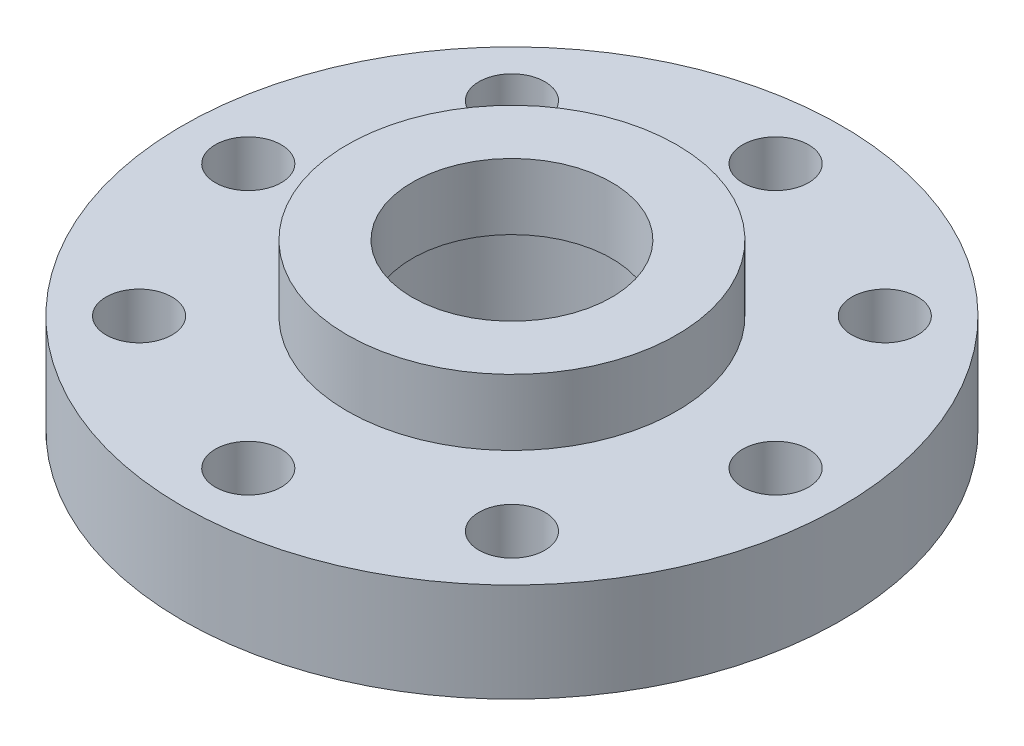
ISO-10303-21;
HEADER;
FILE_DESCRIPTION(('STEP AP214'),'2;1');
FILE_NAME('part.step','',(''),(''),'','','');
FILE_SCHEMA(('AUTOMOTIVE_DESIGN { 1 0 10303 214 1 1 1 1 }'));
ENDSEC;
DATA;
#1=APPLICATION_CONTEXT('core data for automotive mechanical design processes');
#2=APPLICATION_PROTOCOL_DEFINITION('international standard','automotive_design',2000,#1);
#3=PRODUCT_CONTEXT('',#1,'mechanical');
#4=PRODUCT('Part','Part','',(#3));
#5=PRODUCT_RELATED_PRODUCT_CATEGORY('part','',(#4));
#6=PRODUCT_DEFINITION_FORMATION('','',#4);
#7=PRODUCT_DEFINITION_CONTEXT('part definition',#1,'design');
#8=PRODUCT_DEFINITION('design','',#6,#7);
#9=PRODUCT_DEFINITION_SHAPE('','',#8);
#10=(LENGTH_UNIT() NAMED_UNIT(*) SI_UNIT(.MILLI.,.METRE.));
#11=(NAMED_UNIT(*) PLANE_ANGLE_UNIT() SI_UNIT($,.RADIAN.));
#12=(NAMED_UNIT(*) SI_UNIT($,.STERADIAN.) SOLID_ANGLE_UNIT());
#13=UNCERTAINTY_MEASURE_WITH_UNIT(LENGTH_MEASURE(1.E-05),#10,'distance_accuracy_value','');
#14=(GEOMETRIC_REPRESENTATION_CONTEXT(3) GLOBAL_UNCERTAINTY_ASSIGNED_CONTEXT((#13)) GLOBAL_UNIT_ASSIGNED_CONTEXT((#10,
#11,#12)) REPRESENTATION_CONTEXT('',''));
#15=CARTESIAN_POINT('',(0.,0.,0.));
#16=DIRECTION('',(0.,0.,1.));
#17=DIRECTION('',(1.,0.,0.));
#18=AXIS2_PLACEMENT_3D('',#15,#16,#17);
#19=CARTESIAN_POINT('',(0.,3.,0.));
#20=DIRECTION('',(0.,1.,0.));
#21=DIRECTION('',(0.,0.,1.));
#22=AXIS2_PLACEMENT_3D('',#19,#20,#21);
#23=PLANE('',#22);
#24=CARTESIAN_POINT('',(0.,3.,0.));
#25=DIRECTION('',(0.,1.,0.));
#26=DIRECTION('',(0.,0.,1.));
#27=AXIS2_PLACEMENT_3D('',#24,#25,#26);
#28=CIRCLE('',#27,5.);
#29=CARTESIAN_POINT('',(0.,3.,5.));
#30=VERTEX_POINT('',#29);
#31=EDGE_CURVE('E103',#30,#30,#28,.T.);
#32=ORIENTED_EDGE('',*,*,#31,.F.);
#33=EDGE_LOOP('',(#32));
#34=FACE_BOUND('',#33,.T.);
#35=CARTESIAN_POINT('',(-7.99999999999966,3.,3.40570654445189E-13));
#36=DIRECTION('',(0.,1.,0.));
#37=DIRECTION('',(0.,0.,1.));
#38=AXIS2_PLACEMENT_3D('',#35,#36,#37);
#39=CIRCLE('',#38,1.0000000000005);
#40=CARTESIAN_POINT('',(-7.99999999999966,3.,1.00000000000085));
#41=VERTEX_POINT('',#40);
#42=EDGE_CURVE('E85',#41,#41,#39,.T.);
#43=ORIENTED_EDGE('',*,*,#42,.F.);
#44=EDGE_LOOP('',(#43));
#45=FACE_BOUND('',#44,.T.);
#46=CARTESIAN_POINT('',(6.79181874011743E-13,3.,8.));
#47=DIRECTION('',(0.,1.,0.));
#48=DIRECTION('',(0.,0.,1.));
#49=AXIS2_PLACEMENT_3D('',#46,#47,#48);
#50=CIRCLE('',#49,1.0000000000007);
#51=CARTESIAN_POINT('',(6.79181874011743E-13,3.,9.0000000000007));
#52=VERTEX_POINT('',#51);
#53=EDGE_CURVE('E73',#52,#52,#50,.T.);
#54=ORIENTED_EDGE('',*,*,#53,.F.);
#55=EDGE_LOOP('',(#54));
#56=FACE_BOUND('',#55,.T.);
#57=CARTESIAN_POINT('',(8.00000000000034,3.,-3.39590937005871E-13));
#58=DIRECTION('',(0.,1.,0.));
#59=DIRECTION('',(0.,0.,1.));
#60=AXIS2_PLACEMENT_3D('',#57,#58,#59);
#61=CIRCLE('',#60,1.00000000000025);
#62=CARTESIAN_POINT('',(8.00000000000034,3.,0.999999999999913));
#63=VERTEX_POINT('',#62);
#64=EDGE_CURVE('E61',#63,#63,#61,.T.);
#65=ORIENTED_EDGE('',*,*,#64,.F.);
#66=EDGE_LOOP('',(#65));
#67=FACE_BOUND('',#66,.T.);
#68=CARTESIAN_POINT('',(0.,3.,-8.));
#69=DIRECTION('',(0.,1.,0.));
#70=DIRECTION('',(0.,0.,1.));
#71=AXIS2_PLACEMENT_3D('',#68,#69,#70);
#72=CIRCLE('',#71,1.);
#73=CARTESIAN_POINT('',(0.,3.,-7.));
#74=VERTEX_POINT('',#73);
#75=EDGE_CURVE('E51',#74,#74,#72,.T.);
#76=ORIENTED_EDGE('',*,*,#75,.F.);
#77=EDGE_LOOP('',(#76));
#78=FACE_BOUND('',#77,.T.);
#79=CARTESIAN_POINT('',(0.,3.,0.));
#80=DIRECTION('',(0.,1.,0.));
#81=DIRECTION('',(0.,0.,1.));
#82=AXIS2_PLACEMENT_3D('',#79,#80,#81);
#83=CIRCLE('',#82,10.);
#84=CARTESIAN_POINT('',(0.,3.,10.));
#85=VERTEX_POINT('',#84);
#86=EDGE_CURVE('E10',#85,#85,#83,.T.);
#87=ORIENTED_EDGE('',*,*,#86,.T.);
#88=EDGE_LOOP('',(#87));
#89=FACE_BOUND('',#88,.T.);
#90=CARTESIAN_POINT('',(5.65685424949248,3.,-5.65685424949262));
#91=DIRECTION('',(0.,1.,0.));
#92=DIRECTION('',(0.,0.,1.));
#93=AXIS2_PLACEMENT_3D('',#90,#91,#92);
#94=CIRCLE('',#93,1.00000000000004);
#95=CARTESIAN_POINT('',(5.65685424949248,3.,-4.65685424949258));
#96=VERTEX_POINT('',#95);
#97=EDGE_CURVE('E55',#96,#96,#94,.T.);
#98=ORIENTED_EDGE('',*,*,#97,.F.);
#99=EDGE_LOOP('',(#98));
#100=FACE_BOUND('',#99,.T.);
#101=CARTESIAN_POINT('',(5.65685424949296,3.,5.65685424949214));
#102=DIRECTION('',(0.,1.,0.));
#103=DIRECTION('',(0.,0.,1.));
#104=AXIS2_PLACEMENT_3D('',#101,#102,#103);
#105=CIRCLE('',#104,1.00000000000052);
#106=CARTESIAN_POINT('',(5.65685424949296,3.,6.65685424949266));
#107=VERTEX_POINT('',#106);
#108=EDGE_CURVE('E67',#107,#107,#105,.T.);
#109=ORIENTED_EDGE('',*,*,#108,.F.);
#110=EDGE_LOOP('',(#109));
#111=FACE_BOUND('',#110,.T.);
#112=CARTESIAN_POINT('',(-5.6568542494918,3.,5.65685424949262));
#113=DIRECTION('',(0.,1.,0.));
#114=DIRECTION('',(0.,0.,1.));
#115=AXIS2_PLACEMENT_3D('',#112,#113,#114);
#116=CIRCLE('',#115,1.00000000000069);
#117=CARTESIAN_POINT('',(-5.6568542494918,3.,6.65685424949331));
#118=VERTEX_POINT('',#117);
#119=EDGE_CURVE('E79',#118,#118,#116,.T.);
#120=ORIENTED_EDGE('',*,*,#119,.F.);
#121=EDGE_LOOP('',(#120));
#122=FACE_BOUND('',#121,.T.);
#123=CARTESIAN_POINT('',(-5.65685424949228,3.,-5.65685424949214));
#124=DIRECTION('',(0.,1.,0.));
#125=DIRECTION('',(0.,0.,1.));
#126=AXIS2_PLACEMENT_3D('',#123,#124,#125);
#127=CIRCLE('',#126,1.00000000000026);
#128=CARTESIAN_POINT('',(-5.65685424949228,3.,-4.65685424949188));
#129=VERTEX_POINT('',#128);
#130=EDGE_CURVE('E91',#129,#129,#127,.T.);
#131=ORIENTED_EDGE('',*,*,#130,.F.);
#132=EDGE_LOOP('',(#131));
#133=FACE_BOUND('',#132,.T.);
#134=ADVANCED_FACE('F36',(#34,#45,#56,#67,#78,#89,#100,#111,#122,#133),#23,.T.);
#135=CARTESIAN_POINT('',(0.,0.,0.));
#136=DIRECTION('',(0.,1.,0.));
#137=DIRECTION('',(0.,0.,1.));
#138=AXIS2_PLACEMENT_3D('',#135,#136,#137);
#139=PLANE('',#138);
#140=CARTESIAN_POINT('',(0.,0.,0.));
#141=DIRECTION('',(0.,1.,0.));
#142=DIRECTION('',(0.,0.,1.));
#143=AXIS2_PLACEMENT_3D('',#140,#141,#142);
#144=CIRCLE('',#143,10.);
#145=CARTESIAN_POINT('',(0.,0.,10.));
#146=VERTEX_POINT('',#145);
#147=EDGE_CURVE('E40',#146,#146,#144,.T.);
#148=ORIENTED_EDGE('',*,*,#147,.F.);
#149=EDGE_LOOP('',(#148));
#150=FACE_BOUND('',#149,.T.);
#151=CARTESIAN_POINT('',(0.,0.,0.));
#152=DIRECTION('',(0.,1.,0.));
#153=DIRECTION('',(0.,0.,1.));
#154=AXIS2_PLACEMENT_3D('',#151,#152,#153);
#155=CIRCLE('',#154,3.26);
#156=CARTESIAN_POINT('',(0.,0.,3.26));
#157=VERTEX_POINT('',#156);
#158=EDGE_CURVE('E47',#157,#157,#155,.T.);
#159=ORIENTED_EDGE('',*,*,#158,.T.);
#160=EDGE_LOOP('',(#159));
#161=FACE_BOUND('',#160,.T.);
#162=CARTESIAN_POINT('',(0.,0.,-8.));
#163=DIRECTION('',(0.,1.,0.));
#164=DIRECTION('',(0.,0.,1.));
#165=AXIS2_PLACEMENT_3D('',#162,#163,#164);
#166=CIRCLE('',#165,1.);
#167=CARTESIAN_POINT('',(0.,0.,-7.));
#168=VERTEX_POINT('',#167);
#169=EDGE_CURVE('E52',#168,#168,#166,.T.);
#170=ORIENTED_EDGE('',*,*,#169,.T.);
#171=EDGE_LOOP('',(#170));
#172=FACE_BOUND('',#171,.T.);
#173=CARTESIAN_POINT('',(5.65685424949248,0.,-5.65685424949262));
#174=DIRECTION('',(0.,1.,0.));
#175=DIRECTION('',(0.,0.,1.));
#176=AXIS2_PLACEMENT_3D('',#173,#174,#175);
#177=CIRCLE('',#176,1.00000000000004);
#178=CARTESIAN_POINT('',(5.65685424949248,0.,-4.65685424949258));
#179=VERTEX_POINT('',#178);
#180=EDGE_CURVE('E58',#179,#179,#177,.T.);
#181=ORIENTED_EDGE('',*,*,#180,.T.);
#182=EDGE_LOOP('',(#181));
#183=FACE_BOUND('',#182,.T.);
#184=CARTESIAN_POINT('',(8.00000000000034,0.,-3.39590937005871E-13));
#185=DIRECTION('',(0.,1.,0.));
#186=DIRECTION('',(0.,0.,1.));
#187=AXIS2_PLACEMENT_3D('',#184,#185,#186);
#188=CIRCLE('',#187,1.00000000000025);
#189=CARTESIAN_POINT('',(8.00000000000034,0.,0.999999999999913));
#190=VERTEX_POINT('',#189);
#191=EDGE_CURVE('E64',#190,#190,#188,.T.);
#192=ORIENTED_EDGE('',*,*,#191,.T.);
#193=EDGE_LOOP('',(#192));
#194=FACE_BOUND('',#193,.T.);
#195=CARTESIAN_POINT('',(5.65685424949296,0.,5.65685424949214));
#196=DIRECTION('',(0.,1.,0.));
#197=DIRECTION('',(0.,0.,1.));
#198=AXIS2_PLACEMENT_3D('',#195,#196,#197);
#199=CIRCLE('',#198,1.00000000000052);
#200=CARTESIAN_POINT('',(5.65685424949296,0.,6.65685424949266));
#201=VERTEX_POINT('',#200);
#202=EDGE_CURVE('E70',#201,#201,#199,.T.);
#203=ORIENTED_EDGE('',*,*,#202,.T.);
#204=EDGE_LOOP('',(#203));
#205=FACE_BOUND('',#204,.T.);
#206=CARTESIAN_POINT('',(6.79181874011743E-13,0.,8.));
#207=DIRECTION('',(0.,1.,0.));
#208=DIRECTION('',(0.,0.,1.));
#209=AXIS2_PLACEMENT_3D('',#206,#207,#208);
#210=CIRCLE('',#209,1.0000000000007);
#211=CARTESIAN_POINT('',(6.79181874011743E-13,0.,9.0000000000007));
#212=VERTEX_POINT('',#211);
#213=EDGE_CURVE('E76',#212,#212,#210,.T.);
#214=ORIENTED_EDGE('',*,*,#213,.T.);
#215=EDGE_LOOP('',(#214));
#216=FACE_BOUND('',#215,.T.);
#217=CARTESIAN_POINT('',(-5.6568542494918,0.,5.65685424949262));
#218=DIRECTION('',(0.,1.,0.));
#219=DIRECTION('',(0.,0.,1.));
#220=AXIS2_PLACEMENT_3D('',#217,#218,#219);
#221=CIRCLE('',#220,1.00000000000069);
#222=CARTESIAN_POINT('',(-5.6568542494918,0.,6.65685424949331));
#223=VERTEX_POINT('',#222);
#224=EDGE_CURVE('E82',#223,#223,#221,.T.);
#225=ORIENTED_EDGE('',*,*,#224,.T.);
#226=EDGE_LOOP('',(#225));
#227=FACE_BOUND('',#226,.T.);
#228=CARTESIAN_POINT('',(-7.99999999999966,0.,3.40570654445189E-13));
#229=DIRECTION('',(0.,1.,0.));
#230=DIRECTION('',(0.,0.,1.));
#231=AXIS2_PLACEMENT_3D('',#228,#229,#230);
#232=CIRCLE('',#231,1.0000000000005);
#233=CARTESIAN_POINT('',(-7.99999999999966,0.,1.00000000000085));
#234=VERTEX_POINT('',#233);
#235=EDGE_CURVE('E88',#234,#234,#232,.T.);
#236=ORIENTED_EDGE('',*,*,#235,.T.);
#237=EDGE_LOOP('',(#236));
#238=FACE_BOUND('',#237,.T.);
#239=CARTESIAN_POINT('',(-5.65685424949228,0.,-5.65685424949214));
#240=DIRECTION('',(0.,1.,0.));
#241=DIRECTION('',(0.,0.,1.));
#242=AXIS2_PLACEMENT_3D('',#239,#240,#241);
#243=CIRCLE('',#242,1.00000000000026);
#244=CARTESIAN_POINT('',(-5.65685424949228,0.,-4.65685424949188));
#245=VERTEX_POINT('',#244);
#246=EDGE_CURVE('E94',#245,#245,#243,.T.);
#247=ORIENTED_EDGE('',*,*,#246,.T.);
#248=EDGE_LOOP('',(#247));
#249=FACE_BOUND('',#248,.T.);
#250=ADVANCED_FACE('F135',(#150,#161,#172,#183,#194,#205,#216,#227,#238,#249),#139,.F.);
#251=CARTESIAN_POINT('',(0.,3.,0.));
#252=DIRECTION('',(0.,-1.,0.));
#253=DIRECTION('',(0.,0.,-1.));
#254=AXIS2_PLACEMENT_3D('',#251,#252,#253);
#255=CYLINDRICAL_SURFACE('',#254,10.);
#256=ORIENTED_EDGE('',*,*,#86,.F.);
#257=EDGE_LOOP('',(#256));
#258=FACE_BOUND('',#257,.T.);
#259=ORIENTED_EDGE('',*,*,#147,.T.);
#260=EDGE_LOOP('',(#259));
#261=FACE_BOUND('',#260,.T.);
#262=ADVANCED_FACE('F38',(#258,#261),#255,.T.);
#263=CARTESIAN_POINT('',(0.,3.,0.));
#264=DIRECTION('',(0.,-1.,0.));
#265=DIRECTION('',(0.,0.,-1.));
#266=AXIS2_PLACEMENT_3D('',#263,#264,#265);
#267=CYLINDRICAL_SURFACE('',#266,3.26);
#268=CARTESIAN_POINT('',(0.,3.,0.));
#269=DIRECTION('',(0.,1.,0.));
#270=DIRECTION('',(0.,0.,1.));
#271=AXIS2_PLACEMENT_3D('',#268,#269,#270);
#272=CIRCLE('',#271,3.26);
#273=CARTESIAN_POINT('',(0.,3.,3.26));
#274=VERTEX_POINT('',#273);
#275=EDGE_CURVE('E97',#274,#274,#272,.T.);
#276=ORIENTED_EDGE('',*,*,#275,.T.);
#277=EDGE_LOOP('',(#276));
#278=FACE_BOUND('',#277,.T.);
#279=ORIENTED_EDGE('',*,*,#158,.F.);
#280=EDGE_LOOP('',(#279));
#281=FACE_BOUND('',#280,.T.);
#282=ADVANCED_FACE('F145',(#278,#281),#267,.F.);
#283=CARTESIAN_POINT('',(0.,3.,-8.));
#284=DIRECTION('',(0.,-1.,0.));
#285=DIRECTION('',(0.,0.,-1.));
#286=AXIS2_PLACEMENT_3D('',#283,#284,#285);
#287=CYLINDRICAL_SURFACE('',#286,1.);
#288=ORIENTED_EDGE('',*,*,#75,.T.);
#289=EDGE_LOOP('',(#288));
#290=FACE_BOUND('',#289,.T.);
#291=ORIENTED_EDGE('',*,*,#169,.F.);
#292=EDGE_LOOP('',(#291));
#293=FACE_BOUND('',#292,.T.);
#294=ADVANCED_FACE('F148',(#290,#293),#287,.F.);
#295=CARTESIAN_POINT('',(5.65685424949248,3.,-5.65685424949262));
#296=DIRECTION('',(0.,-1.,0.));
#297=DIRECTION('',(0.,0.,-1.));
#298=AXIS2_PLACEMENT_3D('',#295,#296,#297);
#299=CYLINDRICAL_SURFACE('',#298,1.00000000000004);
#300=ORIENTED_EDGE('',*,*,#97,.T.);
#301=EDGE_LOOP('',(#300));
#302=FACE_BOUND('',#301,.T.);
#303=ORIENTED_EDGE('',*,*,#180,.F.);
#304=EDGE_LOOP('',(#303));
#305=FACE_BOUND('',#304,.T.);
#306=ADVANCED_FACE('F152',(#302,#305),#299,.F.);
#307=CARTESIAN_POINT('',(8.00000000000034,3.,-3.39590937005871E-13));
#308=DIRECTION('',(0.,-1.,0.));
#309=DIRECTION('',(0.,0.,-1.));
#310=AXIS2_PLACEMENT_3D('',#307,#308,#309);
#311=CYLINDRICAL_SURFACE('',#310,1.00000000000025);
#312=ORIENTED_EDGE('',*,*,#64,.T.);
#313=EDGE_LOOP('',(#312));
#314=FACE_BOUND('',#313,.T.);
#315=ORIENTED_EDGE('',*,*,#191,.F.);
#316=EDGE_LOOP('',(#315));
#317=FACE_BOUND('',#316,.T.);
#318=ADVANCED_FACE('F156',(#314,#317),#311,.F.);
#319=CARTESIAN_POINT('',(5.65685424949296,3.,5.65685424949214));
#320=DIRECTION('',(0.,-1.,0.));
#321=DIRECTION('',(0.,0.,-1.));
#322=AXIS2_PLACEMENT_3D('',#319,#320,#321);
#323=CYLINDRICAL_SURFACE('',#322,1.00000000000052);
#324=ORIENTED_EDGE('',*,*,#108,.T.);
#325=EDGE_LOOP('',(#324));
#326=FACE_BOUND('',#325,.T.);
#327=ORIENTED_EDGE('',*,*,#202,.F.);
#328=EDGE_LOOP('',(#327));
#329=FACE_BOUND('',#328,.T.);
#330=ADVANCED_FACE('F160',(#326,#329),#323,.F.);
#331=CARTESIAN_POINT('',(6.79181874011743E-13,3.,8.));
#332=DIRECTION('',(0.,-1.,0.));
#333=DIRECTION('',(0.,0.,-1.));
#334=AXIS2_PLACEMENT_3D('',#331,#332,#333);
#335=CYLINDRICAL_SURFACE('',#334,1.0000000000007);
#336=ORIENTED_EDGE('',*,*,#53,.T.);
#337=EDGE_LOOP('',(#336));
#338=FACE_BOUND('',#337,.T.);
#339=ORIENTED_EDGE('',*,*,#213,.F.);
#340=EDGE_LOOP('',(#339));
#341=FACE_BOUND('',#340,.T.);
#342=ADVANCED_FACE('F164',(#338,#341),#335,.F.);
#343=CARTESIAN_POINT('',(-5.6568542494918,3.,5.65685424949262));
#344=DIRECTION('',(0.,-1.,0.));
#345=DIRECTION('',(0.,0.,-1.));
#346=AXIS2_PLACEMENT_3D('',#343,#344,#345);
#347=CYLINDRICAL_SURFACE('',#346,1.00000000000069);
#348=ORIENTED_EDGE('',*,*,#119,.T.);
#349=EDGE_LOOP('',(#348));
#350=FACE_BOUND('',#349,.T.);
#351=ORIENTED_EDGE('',*,*,#224,.F.);
#352=EDGE_LOOP('',(#351));
#353=FACE_BOUND('',#352,.T.);
#354=ADVANCED_FACE('F168',(#350,#353),#347,.F.);
#355=CARTESIAN_POINT('',(-7.99999999999966,3.,3.40570654445189E-13));
#356=DIRECTION('',(0.,-1.,0.));
#357=DIRECTION('',(0.,0.,-1.));
#358=AXIS2_PLACEMENT_3D('',#355,#356,#357);
#359=CYLINDRICAL_SURFACE('',#358,1.0000000000005);
#360=ORIENTED_EDGE('',*,*,#42,.T.);
#361=EDGE_LOOP('',(#360));
#362=FACE_BOUND('',#361,.T.);
#363=ORIENTED_EDGE('',*,*,#235,.F.);
#364=EDGE_LOOP('',(#363));
#365=FACE_BOUND('',#364,.T.);
#366=ADVANCED_FACE('F172',(#362,#365),#359,.F.);
#367=CARTESIAN_POINT('',(-5.65685424949228,3.,-5.65685424949214));
#368=DIRECTION('',(0.,-1.,0.));
#369=DIRECTION('',(0.,0.,-1.));
#370=AXIS2_PLACEMENT_3D('',#367,#368,#369);
#371=CYLINDRICAL_SURFACE('',#370,1.00000000000026);
#372=ORIENTED_EDGE('',*,*,#130,.T.);
#373=EDGE_LOOP('',(#372));
#374=FACE_BOUND('',#373,.T.);
#375=ORIENTED_EDGE('',*,*,#246,.F.);
#376=EDGE_LOOP('',(#375));
#377=FACE_BOUND('',#376,.T.);
#378=ADVANCED_FACE('F130',(#374,#377),#371,.F.);
#379=CARTESIAN_POINT('',(0.,3.,0.));
#380=DIRECTION('',(0.,1.,0.));
#381=DIRECTION('',(0.,0.,1.));
#382=AXIS2_PLACEMENT_3D('',#379,#380,#381);
#383=PLANE('',#382);
#384=CARTESIAN_POINT('',(0.,3.,0.));
#385=DIRECTION('',(0.,1.,0.));
#386=DIRECTION('',(0.,0.,1.));
#387=AXIS2_PLACEMENT_3D('',#384,#385,#386);
#388=CIRCLE('',#387,3.025);
#389=CARTESIAN_POINT('',(0.,3.,3.025));
#390=VERTEX_POINT('',#389);
#391=EDGE_CURVE('E109',#390,#390,#388,.T.);
#392=ORIENTED_EDGE('',*,*,#391,.T.);
#393=EDGE_LOOP('',(#392));
#394=FACE_BOUND('',#393,.T.);
#395=ORIENTED_EDGE('',*,*,#275,.F.);
#396=EDGE_LOOP('',(#395));
#397=FACE_BOUND('',#396,.T.);
#398=ADVANCED_FACE('F121',(#394,#397),#383,.F.);
#399=CARTESIAN_POINT('',(0.,5.,0.));
#400=DIRECTION('',(0.,1.,0.));
#401=DIRECTION('',(0.,0.,1.));
#402=AXIS2_PLACEMENT_3D('',#399,#400,#401);
#403=PLANE('',#402);
#404=CARTESIAN_POINT('',(0.,5.,0.));
#405=DIRECTION('',(0.,1.,0.));
#406=DIRECTION('',(0.,0.,1.));
#407=AXIS2_PLACEMENT_3D('',#404,#405,#406);
#408=CIRCLE('',#407,5.);
#409=CARTESIAN_POINT('',(0.,5.,5.));
#410=VERTEX_POINT('',#409);
#411=EDGE_CURVE('E102',#410,#410,#408,.T.);
#412=ORIENTED_EDGE('',*,*,#411,.T.);
#413=EDGE_LOOP('',(#412));
#414=FACE_BOUND('',#413,.T.);
#415=CARTESIAN_POINT('',(0.,5.,0.));
#416=DIRECTION('',(0.,1.,0.));
#417=DIRECTION('',(0.,0.,1.));
#418=AXIS2_PLACEMENT_3D('',#415,#416,#417);
#419=CIRCLE('',#418,3.025);
#420=CARTESIAN_POINT('',(0.,5.,3.025));
#421=VERTEX_POINT('',#420);
#422=EDGE_CURVE('E106',#421,#421,#419,.T.);
#423=ORIENTED_EDGE('',*,*,#422,.F.);
#424=EDGE_LOOP('',(#423));
#425=FACE_BOUND('',#424,.T.);
#426=ADVANCED_FACE('F118',(#414,#425),#403,.T.);
#427=CARTESIAN_POINT('',(0.,5.,0.));
#428=DIRECTION('',(0.,-1.,0.));
#429=DIRECTION('',(0.,0.,-1.));
#430=AXIS2_PLACEMENT_3D('',#427,#428,#429);
#431=CYLINDRICAL_SURFACE('',#430,5.);
#432=ORIENTED_EDGE('',*,*,#411,.F.);
#433=EDGE_LOOP('',(#432));
#434=FACE_BOUND('',#433,.T.);
#435=ORIENTED_EDGE('',*,*,#31,.T.);
#436=EDGE_LOOP('',(#435));
#437=FACE_BOUND('',#436,.T.);
#438=ADVANCED_FACE('F120',(#434,#437),#431,.T.);
#439=CARTESIAN_POINT('',(0.,5.,0.));
#440=DIRECTION('',(0.,-1.,0.));
#441=DIRECTION('',(0.,0.,-1.));
#442=AXIS2_PLACEMENT_3D('',#439,#440,#441);
#443=CYLINDRICAL_SURFACE('',#442,3.025);
#444=ORIENTED_EDGE('',*,*,#422,.T.);
#445=EDGE_LOOP('',(#444));
#446=FACE_BOUND('',#445,.T.);
#447=ORIENTED_EDGE('',*,*,#391,.F.);
#448=EDGE_LOOP('',(#447));
#449=FACE_BOUND('',#448,.T.);
#450=ADVANCED_FACE('F115',(#446,#449),#443,.F.);
#451=CLOSED_SHELL('',(#134,#250,#262,#282,#294,#306,#318,#330,#342,#354,#366,#378,#398,#426,
#438,#450));
#452=MANIFOLD_SOLID_BREP('B2',#451);
#453=ADVANCED_BREP_SHAPE_REPRESENTATION('',(#18,#452),#14);
#454=SHAPE_DEFINITION_REPRESENTATION(#9,#453);
ENDSEC;
END-ISO-10303-21;
